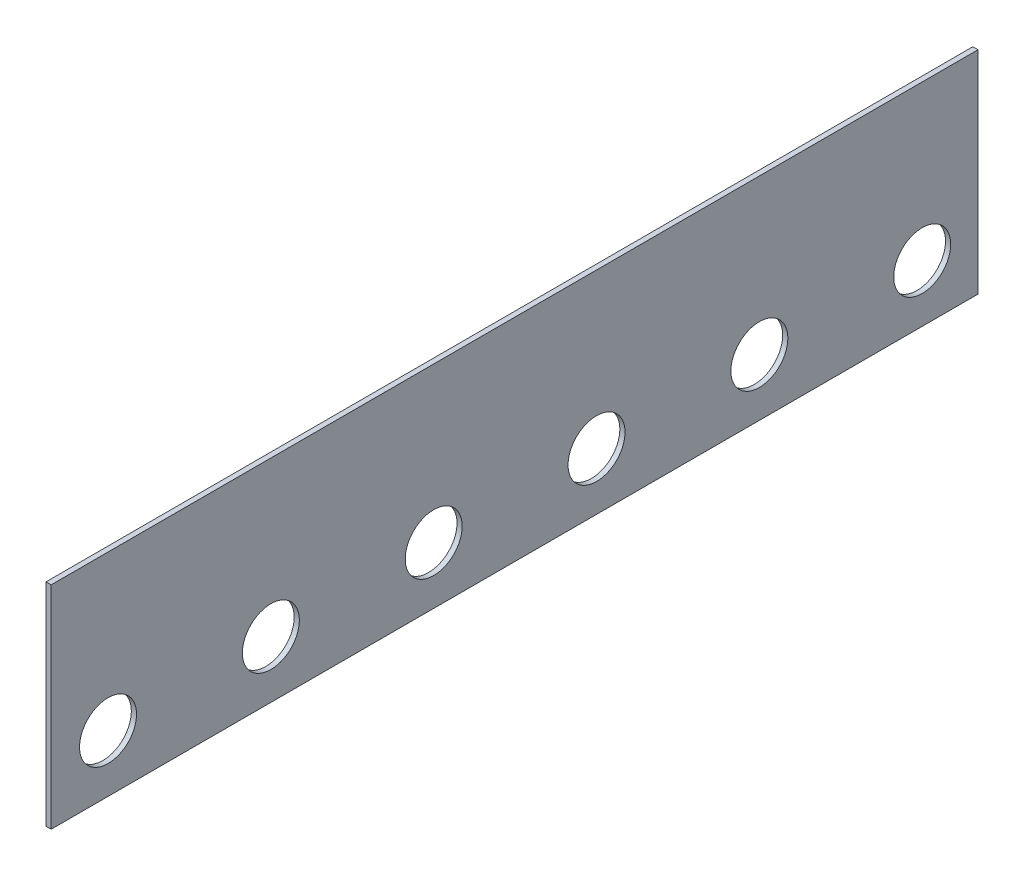
ISO-10303-21;
HEADER;
FILE_DESCRIPTION(('STEP AP214'),'2;1');
FILE_NAME('part.step','',(''),(''),'','','');
FILE_SCHEMA(('AUTOMOTIVE_DESIGN { 1 0 10303 214 1 1 1 1 }'));
ENDSEC;
DATA;
#1=APPLICATION_CONTEXT('core data for automotive mechanical design processes');
#2=APPLICATION_PROTOCOL_DEFINITION('international standard','automotive_design',2000,#1);
#3=PRODUCT_CONTEXT('',#1,'mechanical');
#4=PRODUCT('Part','Part','',(#3));
#5=PRODUCT_RELATED_PRODUCT_CATEGORY('part','',(#4));
#6=PRODUCT_DEFINITION_FORMATION('','',#4);
#7=PRODUCT_DEFINITION_CONTEXT('part definition',#1,'design');
#8=PRODUCT_DEFINITION('design','',#6,#7);
#9=PRODUCT_DEFINITION_SHAPE('','',#8);
#10=(LENGTH_UNIT() NAMED_UNIT(*) SI_UNIT(.MILLI.,.METRE.));
#11=(NAMED_UNIT(*) PLANE_ANGLE_UNIT() SI_UNIT($,.RADIAN.));
#12=(NAMED_UNIT(*) SI_UNIT($,.STERADIAN.) SOLID_ANGLE_UNIT());
#13=UNCERTAINTY_MEASURE_WITH_UNIT(LENGTH_MEASURE(1.E-05),#10,'distance_accuracy_value','');
#14=(GEOMETRIC_REPRESENTATION_CONTEXT(3) GLOBAL_UNCERTAINTY_ASSIGNED_CONTEXT((#13)) GLOBAL_UNIT_ASSIGNED_CONTEXT((#10,
#11,#12)) REPRESENTATION_CONTEXT('',''));
#15=CARTESIAN_POINT('',(0.,0.,0.));
#16=DIRECTION('',(0.,0.,1.));
#17=DIRECTION('',(1.,0.,0.));
#18=AXIS2_PLACEMENT_3D('',#15,#16,#17);
#19=CARTESIAN_POINT('',(3.175,0.,264.709663373096));
#20=DIRECTION('',(1.,0.,0.));
#21=DIRECTION('',(0.,0.,-1.));
#22=AXIS2_PLACEMENT_3D('',#19,#20,#21);
#23=PLANE('',#22);
#24=CARTESIAN_POINT('',(3.175,1.01307850997046E-13,-135.290336626904));
#25=DIRECTION('',(1.,0.,0.));
#26=DIRECTION('',(0.,0.,-1.));
#27=AXIS2_PLACEMENT_3D('',#24,#25,#26);
#28=CIRCLE('',#27,17.5);
#29=CARTESIAN_POINT('',(3.175,1.01307850997046E-13,-152.790336626904));
#30=VERTEX_POINT('',#29);
#31=EDGE_CURVE('E170',#30,#30,#28,.T.);
#32=ORIENTED_EDGE('',*,*,#31,.F.);
#33=EDGE_LOOP('',(#32));
#34=FACE_BOUND('',#33,.T.);
#35=CARTESIAN_POINT('',(3.175,0.,64.7096633730958));
#36=DIRECTION('',(1.,0.,0.));
#37=DIRECTION('',(0.,0.,-1.));
#38=AXIS2_PLACEMENT_3D('',#35,#36,#37);
#39=CIRCLE('',#38,17.5);
#40=CARTESIAN_POINT('',(3.175,0.,47.2096633730957));
#41=VERTEX_POINT('',#40);
#42=EDGE_CURVE('E158',#41,#41,#39,.T.);
#43=ORIENTED_EDGE('',*,*,#42,.F.);
#44=EDGE_LOOP('',(#43));
#45=FACE_BOUND('',#44,.T.);
#46=CARTESIAN_POINT('',(3.175,0.,264.709663373096));
#47=DIRECTION('',(1.,0.,0.));
#48=DIRECTION('',(0.,0.,-1.));
#49=AXIS2_PLACEMENT_3D('',#46,#47,#48);
#50=CIRCLE('',#49,17.5);
#51=CARTESIAN_POINT('',(3.175,0.,247.209663373096));
#52=VERTEX_POINT('',#51);
#53=EDGE_CURVE('E127',#52,#52,#50,.T.);
#54=ORIENTED_EDGE('',*,*,#53,.F.);
#55=EDGE_LOOP('',(#54));
#56=FACE_BOUND('',#55,.T.);
#57=DIRECTION('',(0.,1.,0.));
#58=VECTOR('',#57,1.);
#59=CARTESIAN_POINT('',(3.175,7.5,-269.561502976641));
#60=LINE('',#59,#58);
#61=CARTESIAN_POINT('',(3.175,-34.9990034721348,-269.561502976641));
#62=VERTEX_POINT('',#61);
#63=CARTESIAN_POINT('',(3.175,94.9999999999998,-269.561502976641));
#64=VERTEX_POINT('',#63);
#65=EDGE_CURVE('E51',#62,#64,#60,.T.);
#66=ORIENTED_EDGE('',*,*,#65,.T.);
#67=DIRECTION('',(0.,0.,1.));
#68=VECTOR('',#67,1.);
#69=CARTESIAN_POINT('',(3.175,94.9999999999997,299.6284595529));
#70=LINE('',#69,#68);
#71=CARTESIAN_POINT('',(3.175,94.9999999999997,299.6284595529));
#72=VERTEX_POINT('',#71);
#73=EDGE_CURVE('E89',#64,#72,#70,.T.);
#74=ORIENTED_EDGE('',*,*,#73,.T.);
#75=DIRECTION('',(0.,-1.,0.));
#76=VECTOR('',#75,1.);
#77=CARTESIAN_POINT('',(3.175,-1.13674568028599E-13,299.6284595529));
#78=LINE('',#77,#76);
#79=CARTESIAN_POINT('',(3.175,-35.,299.6284595529));
#80=VERTEX_POINT('',#79);
#81=EDGE_CURVE('E103',#72,#80,#78,.T.);
#82=ORIENTED_EDGE('',*,*,#81,.T.);
#83=DIRECTION('',(0.,0.,-1.));
#84=VECTOR('',#83,1.);
#85=CARTESIAN_POINT('',(3.175,-35.,265.081967213115));
#86=LINE('',#85,#84);
#87=CARTESIAN_POINT('',(3.175,-35.,265.081967213115));
#88=VERTEX_POINT('',#87);
#89=EDGE_CURVE('E97',#80,#88,#86,.T.);
#90=ORIENTED_EDGE('',*,*,#89,.T.);
#91=CARTESIAN_POINT('',(3.175,0.,264.709663373096));
#92=DIRECTION('',(-1.,0.,0.));
#93=DIRECTION('',(0.,0.,-1.));
#94=AXIS2_PLACEMENT_3D('',#91,#92,#93);
#95=CIRCLE('',#94,35.0019800889791);
#96=CARTESIAN_POINT('',(3.175,-34.9990034721349,265.166134737783));
#97=VERTEX_POINT('',#96);
#98=EDGE_CURVE('E101',#88,#97,#95,.T.);
#99=ORIENTED_EDGE('',*,*,#98,.T.);
#100=DIRECTION('',(0.,0.,-1.));
#101=VECTOR('',#100,1.);
#102=CARTESIAN_POINT('',(3.175,-34.9990034721348,265.166134737783));
#103=LINE('',#102,#101);
#104=EDGE_CURVE('E117',#97,#62,#103,.T.);
#105=ORIENTED_EDGE('',*,*,#104,.T.);
#106=EDGE_LOOP('',(#66,#74,#82,#90,#99,#105));
#107=FACE_BOUND('',#106,.T.);
#108=CARTESIAN_POINT('',(3.175,0.,164.709663373096));
#109=DIRECTION('',(1.,0.,0.));
#110=DIRECTION('',(0.,0.,-1.));
#111=AXIS2_PLACEMENT_3D('',#108,#109,#110);
#112=CIRCLE('',#111,17.5);
#113=CARTESIAN_POINT('',(3.175,0.,147.209663373096));
#114=VERTEX_POINT('',#113);
#115=EDGE_CURVE('E152',#114,#114,#112,.T.);
#116=ORIENTED_EDGE('',*,*,#115,.F.);
#117=EDGE_LOOP('',(#116));
#118=FACE_BOUND('',#117,.T.);
#119=CARTESIAN_POINT('',(3.175,0.,-35.2903366269043));
#120=DIRECTION('',(1.,0.,0.));
#121=DIRECTION('',(0.,0.,-1.));
#122=AXIS2_PLACEMENT_3D('',#119,#120,#121);
#123=CIRCLE('',#122,17.5);
#124=CARTESIAN_POINT('',(3.175,0.,-52.7903366269043));
#125=VERTEX_POINT('',#124);
#126=EDGE_CURVE('E164',#125,#125,#123,.T.);
#127=ORIENTED_EDGE('',*,*,#126,.F.);
#128=EDGE_LOOP('',(#127));
#129=FACE_BOUND('',#128,.T.);
#130=CARTESIAN_POINT('',(3.175,1.2490009027033E-13,-235.290336626904));
#131=DIRECTION('',(1.,0.,0.));
#132=DIRECTION('',(0.,0.,-1.));
#133=AXIS2_PLACEMENT_3D('',#130,#131,#132);
#134=CIRCLE('',#133,17.5000000000001);
#135=CARTESIAN_POINT('',(3.175,1.2490009027033E-13,-252.790336626904));
#136=VERTEX_POINT('',#135);
#137=EDGE_CURVE('E176',#136,#136,#134,.T.);
#138=ORIENTED_EDGE('',*,*,#137,.F.);
#139=EDGE_LOOP('',(#138));
#140=FACE_BOUND('',#139,.T.);
#141=ADVANCED_FACE('F34',(#34,#45,#56,#107,#118,#129,#140),#23,.T.);
#142=CARTESIAN_POINT('',(0.,0.,264.709663373096));
#143=DIRECTION('',(1.,0.,0.));
#144=DIRECTION('',(0.,0.,-1.));
#145=AXIS2_PLACEMENT_3D('',#142,#143,#144);
#146=PLANE('',#145);
#147=DIRECTION('',(0.,0.,1.));
#148=VECTOR('',#147,1.);
#149=CARTESIAN_POINT('',(0.,94.9999999999997,299.6284595529));
#150=LINE('',#149,#148);
#151=CARTESIAN_POINT('',(0.,94.9999999999998,-269.561502976641));
#152=VERTEX_POINT('',#151);
#153=CARTESIAN_POINT('',(0.,94.9999999999997,299.6284595529));
#154=VERTEX_POINT('',#153);
#155=EDGE_CURVE('E123',#152,#154,#150,.T.);
#156=ORIENTED_EDGE('',*,*,#155,.F.);
#157=DIRECTION('',(0.,1.,0.));
#158=VECTOR('',#157,1.);
#159=CARTESIAN_POINT('',(0.,7.5,-269.561502976641));
#160=LINE('',#159,#158);
#161=CARTESIAN_POINT('',(0.,-34.9990034721348,-269.561502976641));
#162=VERTEX_POINT('',#161);
#163=EDGE_CURVE('E132',#162,#152,#160,.T.);
#164=ORIENTED_EDGE('',*,*,#163,.F.);
#165=DIRECTION('',(0.,0.,-1.));
#166=VECTOR('',#165,1.);
#167=CARTESIAN_POINT('',(0.,-34.9990034721348,265.166134737783));
#168=LINE('',#167,#166);
#169=CARTESIAN_POINT('',(0.,-34.9990034721349,265.166134737783));
#170=VERTEX_POINT('',#169);
#171=EDGE_CURVE('E82',#170,#162,#168,.T.);
#172=ORIENTED_EDGE('',*,*,#171,.F.);
#173=CARTESIAN_POINT('',(0.,0.,264.709663373096));
#174=DIRECTION('',(-1.,0.,0.));
#175=DIRECTION('',(0.,0.,-1.));
#176=AXIS2_PLACEMENT_3D('',#173,#174,#175);
#177=CIRCLE('',#176,35.0019800889791);
#178=CARTESIAN_POINT('',(0.,-35.,265.081967213115));
#179=VERTEX_POINT('',#178);
#180=EDGE_CURVE('E75',#179,#170,#177,.T.);
#181=ORIENTED_EDGE('',*,*,#180,.F.);
#182=DIRECTION('',(0.,0.,-1.));
#183=VECTOR('',#182,1.);
#184=CARTESIAN_POINT('',(0.,-35.,265.081967213115));
#185=LINE('',#184,#183);
#186=CARTESIAN_POINT('',(0.,-35.,299.6284595529));
#187=VERTEX_POINT('',#186);
#188=EDGE_CURVE('E111',#187,#179,#185,.T.);
#189=ORIENTED_EDGE('',*,*,#188,.F.);
#190=DIRECTION('',(0.,-1.,0.));
#191=VECTOR('',#190,1.);
#192=CARTESIAN_POINT('',(0.,-1.13674568028599E-13,299.6284595529));
#193=LINE('',#192,#191);
#194=EDGE_CURVE('E126',#154,#187,#193,.T.);
#195=ORIENTED_EDGE('',*,*,#194,.F.);
#196=EDGE_LOOP('',(#156,#164,#172,#181,#189,#195));
#197=FACE_BOUND('',#196,.T.);
#198=CARTESIAN_POINT('',(0.,0.,264.709663373096));
#199=DIRECTION('',(1.,0.,0.));
#200=DIRECTION('',(0.,0.,-1.));
#201=AXIS2_PLACEMENT_3D('',#198,#199,#200);
#202=CIRCLE('',#201,17.5);
#203=CARTESIAN_POINT('',(0.,0.,247.209663373096));
#204=VERTEX_POINT('',#203);
#205=EDGE_CURVE('E149',#204,#204,#202,.T.);
#206=ORIENTED_EDGE('',*,*,#205,.T.);
#207=EDGE_LOOP('',(#206));
#208=FACE_BOUND('',#207,.T.);
#209=CARTESIAN_POINT('',(0.,0.,164.709663373096));
#210=DIRECTION('',(1.,0.,0.));
#211=DIRECTION('',(0.,0.,-1.));
#212=AXIS2_PLACEMENT_3D('',#209,#210,#211);
#213=CIRCLE('',#212,17.5);
#214=CARTESIAN_POINT('',(0.,0.,147.209663373096));
#215=VERTEX_POINT('',#214);
#216=EDGE_CURVE('E155',#215,#215,#213,.T.);
#217=ORIENTED_EDGE('',*,*,#216,.T.);
#218=EDGE_LOOP('',(#217));
#219=FACE_BOUND('',#218,.T.);
#220=CARTESIAN_POINT('',(0.,0.,64.7096633730958));
#221=DIRECTION('',(1.,0.,0.));
#222=DIRECTION('',(0.,0.,-1.));
#223=AXIS2_PLACEMENT_3D('',#220,#221,#222);
#224=CIRCLE('',#223,17.5);
#225=CARTESIAN_POINT('',(0.,0.,47.2096633730957));
#226=VERTEX_POINT('',#225);
#227=EDGE_CURVE('E161',#226,#226,#224,.T.);
#228=ORIENTED_EDGE('',*,*,#227,.T.);
#229=EDGE_LOOP('',(#228));
#230=FACE_BOUND('',#229,.T.);
#231=CARTESIAN_POINT('',(0.,0.,-35.2903366269043));
#232=DIRECTION('',(1.,0.,0.));
#233=DIRECTION('',(0.,0.,-1.));
#234=AXIS2_PLACEMENT_3D('',#231,#232,#233);
#235=CIRCLE('',#234,17.5);
#236=CARTESIAN_POINT('',(0.,0.,-52.7903366269043));
#237=VERTEX_POINT('',#236);
#238=EDGE_CURVE('E167',#237,#237,#235,.T.);
#239=ORIENTED_EDGE('',*,*,#238,.T.);
#240=EDGE_LOOP('',(#239));
#241=FACE_BOUND('',#240,.T.);
#242=CARTESIAN_POINT('',(0.,1.01307850997046E-13,-135.290336626904));
#243=DIRECTION('',(1.,0.,0.));
#244=DIRECTION('',(0.,0.,-1.));
#245=AXIS2_PLACEMENT_3D('',#242,#243,#244);
#246=CIRCLE('',#245,17.5);
#247=CARTESIAN_POINT('',(0.,1.01307850997046E-13,-152.790336626904));
#248=VERTEX_POINT('',#247);
#249=EDGE_CURVE('E173',#248,#248,#246,.T.);
#250=ORIENTED_EDGE('',*,*,#249,.T.);
#251=EDGE_LOOP('',(#250));
#252=FACE_BOUND('',#251,.T.);
#253=CARTESIAN_POINT('',(0.,1.2490009027033E-13,-235.290336626904));
#254=DIRECTION('',(1.,0.,0.));
#255=DIRECTION('',(0.,0.,-1.));
#256=AXIS2_PLACEMENT_3D('',#253,#254,#255);
#257=CIRCLE('',#256,17.5000000000001);
#258=CARTESIAN_POINT('',(0.,1.2490009027033E-13,-252.790336626904));
#259=VERTEX_POINT('',#258);
#260=EDGE_CURVE('E179',#259,#259,#257,.T.);
#261=ORIENTED_EDGE('',*,*,#260,.T.);
#262=EDGE_LOOP('',(#261));
#263=FACE_BOUND('',#262,.T.);
#264=ADVANCED_FACE('F142',(#197,#208,#219,#230,#241,#252,#263),#146,.F.);
#265=CARTESIAN_POINT('',(3.175,94.9999999999997,299.6284595529));
#266=DIRECTION('',(0.,-1.,0.));
#267=DIRECTION('',(0.,0.,-1.));
#268=AXIS2_PLACEMENT_3D('',#265,#266,#267);
#269=PLANE('',#268);
#270=ORIENTED_EDGE('',*,*,#155,.T.);
#271=DIRECTION('',(-1.,0.,0.));
#272=VECTOR('',#271,1.);
#273=CARTESIAN_POINT('',(3.175,94.9999999999997,299.6284595529));
#274=LINE('',#273,#272);
#275=EDGE_CURVE('E43',#72,#154,#274,.T.);
#276=ORIENTED_EDGE('',*,*,#275,.F.);
#277=ORIENTED_EDGE('',*,*,#73,.F.);
#278=DIRECTION('',(-1.,0.,0.));
#279=VECTOR('',#278,1.);
#280=CARTESIAN_POINT('',(3.175,94.9999999999998,-269.561502976641));
#281=LINE('',#280,#279);
#282=EDGE_CURVE('E11',#64,#152,#281,.T.);
#283=ORIENTED_EDGE('',*,*,#282,.T.);
#284=EDGE_LOOP('',(#270,#276,#277,#283));
#285=FACE_BOUND('',#284,.T.);
#286=ADVANCED_FACE('F36',(#285),#269,.F.);
#287=CARTESIAN_POINT('',(3.175,-1.13674568028599E-13,299.6284595529));
#288=DIRECTION('',(0.,0.,-1.));
#289=DIRECTION('',(-1.,0.,0.));
#290=AXIS2_PLACEMENT_3D('',#287,#288,#289);
#291=PLANE('',#290);
#292=ORIENTED_EDGE('',*,*,#194,.T.);
#293=DIRECTION('',(-1.,0.,0.));
#294=VECTOR('',#293,1.);
#295=CARTESIAN_POINT('',(3.175,-35.,299.6284595529));
#296=LINE('',#295,#294);
#297=EDGE_CURVE('E112',#80,#187,#296,.T.);
#298=ORIENTED_EDGE('',*,*,#297,.F.);
#299=ORIENTED_EDGE('',*,*,#81,.F.);
#300=ORIENTED_EDGE('',*,*,#275,.T.);
#301=EDGE_LOOP('',(#292,#298,#299,#300));
#302=FACE_BOUND('',#301,.T.);
#303=ADVANCED_FACE('F138',(#302),#291,.F.);
#304=CARTESIAN_POINT('',(3.175,-35.,265.081967213115));
#305=DIRECTION('',(0.,1.,0.));
#306=DIRECTION('',(0.,0.,1.));
#307=AXIS2_PLACEMENT_3D('',#304,#305,#306);
#308=PLANE('',#307);
#309=ORIENTED_EDGE('',*,*,#188,.T.);
#310=DIRECTION('',(-1.,0.,0.));
#311=VECTOR('',#310,1.);
#312=CARTESIAN_POINT('',(3.175,-35.,265.081967213115));
#313=LINE('',#312,#311);
#314=EDGE_CURVE('E108',#88,#179,#313,.T.);
#315=ORIENTED_EDGE('',*,*,#314,.F.);
#316=ORIENTED_EDGE('',*,*,#89,.F.);
#317=ORIENTED_EDGE('',*,*,#297,.T.);
#318=EDGE_LOOP('',(#309,#315,#316,#317));
#319=FACE_BOUND('',#318,.T.);
#320=ADVANCED_FACE('F109',(#319),#308,.F.);
#321=CARTESIAN_POINT('',(3.175,0.,264.709663373096));
#322=DIRECTION('',(-1.,0.,0.));
#323=DIRECTION('',(0.,0.,1.));
#324=AXIS2_PLACEMENT_3D('',#321,#322,#323);
#325=CYLINDRICAL_SURFACE('',#324,35.0019800889791);
#326=ORIENTED_EDGE('',*,*,#180,.T.);
#327=DIRECTION('',(-1.,0.,0.));
#328=VECTOR('',#327,1.);
#329=CARTESIAN_POINT('',(3.175,-34.9990034721349,265.166134737783));
#330=LINE('',#329,#328);
#331=EDGE_CURVE('E113',#97,#170,#330,.T.);
#332=ORIENTED_EDGE('',*,*,#331,.F.);
#333=ORIENTED_EDGE('',*,*,#98,.F.);
#334=ORIENTED_EDGE('',*,*,#314,.T.);
#335=EDGE_LOOP('',(#326,#332,#333,#334));
#336=FACE_BOUND('',#335,.T.);
#337=ADVANCED_FACE('F115',(#336),#325,.F.);
#338=CARTESIAN_POINT('',(3.175,-34.9990034721348,265.166134737783));
#339=DIRECTION('',(0.,1.,0.));
#340=DIRECTION('',(0.,0.,1.));
#341=AXIS2_PLACEMENT_3D('',#338,#339,#340);
#342=PLANE('',#341);
#343=ORIENTED_EDGE('',*,*,#171,.T.);
#344=DIRECTION('',(-1.,0.,0.));
#345=VECTOR('',#344,1.);
#346=CARTESIAN_POINT('',(3.175,-34.9990034721348,-269.561502976641));
#347=LINE('',#346,#345);
#348=EDGE_CURVE('E119',#62,#162,#347,.T.);
#349=ORIENTED_EDGE('',*,*,#348,.F.);
#350=ORIENTED_EDGE('',*,*,#104,.F.);
#351=ORIENTED_EDGE('',*,*,#331,.T.);
#352=EDGE_LOOP('',(#343,#349,#350,#351));
#353=FACE_BOUND('',#352,.T.);
#354=ADVANCED_FACE('F145',(#353),#342,.F.);
#355=CARTESIAN_POINT('',(3.175,7.5,-269.561502976641));
#356=DIRECTION('',(0.,0.,1.));
#357=DIRECTION('',(1.,0.,0.));
#358=AXIS2_PLACEMENT_3D('',#355,#356,#357);
#359=PLANE('',#358);
#360=ORIENTED_EDGE('',*,*,#163,.T.);
#361=ORIENTED_EDGE('',*,*,#282,.F.);
#362=ORIENTED_EDGE('',*,*,#65,.F.);
#363=ORIENTED_EDGE('',*,*,#348,.T.);
#364=EDGE_LOOP('',(#360,#361,#362,#363));
#365=FACE_BOUND('',#364,.T.);
#366=ADVANCED_FACE('F144',(#365),#359,.F.);
#367=CARTESIAN_POINT('',(3.175,0.,264.709663373096));
#368=DIRECTION('',(-1.,0.,0.));
#369=DIRECTION('',(0.,0.,1.));
#370=AXIS2_PLACEMENT_3D('',#367,#368,#369);
#371=CYLINDRICAL_SURFACE('',#370,17.5);
#372=ORIENTED_EDGE('',*,*,#53,.T.);
#373=EDGE_LOOP('',(#372));
#374=FACE_BOUND('',#373,.T.);
#375=ORIENTED_EDGE('',*,*,#205,.F.);
#376=EDGE_LOOP('',(#375));
#377=FACE_BOUND('',#376,.T.);
#378=ADVANCED_FACE('F198',(#374,#377),#371,.F.);
#379=CARTESIAN_POINT('',(3.175,0.,164.709663373096));
#380=DIRECTION('',(-1.,0.,0.));
#381=DIRECTION('',(0.,0.,1.));
#382=AXIS2_PLACEMENT_3D('',#379,#380,#381);
#383=CYLINDRICAL_SURFACE('',#382,17.5);
#384=ORIENTED_EDGE('',*,*,#115,.T.);
#385=EDGE_LOOP('',(#384));
#386=FACE_BOUND('',#385,.T.);
#387=ORIENTED_EDGE('',*,*,#216,.F.);
#388=EDGE_LOOP('',(#387));
#389=FACE_BOUND('',#388,.T.);
#390=ADVANCED_FACE('F264',(#386,#389),#383,.F.);
#391=CARTESIAN_POINT('',(3.175,0.,64.7096633730958));
#392=DIRECTION('',(-1.,0.,0.));
#393=DIRECTION('',(0.,0.,1.));
#394=AXIS2_PLACEMENT_3D('',#391,#392,#393);
#395=CYLINDRICAL_SURFACE('',#394,17.5);
#396=ORIENTED_EDGE('',*,*,#42,.T.);
#397=EDGE_LOOP('',(#396));
#398=FACE_BOUND('',#397,.T.);
#399=ORIENTED_EDGE('',*,*,#227,.F.);
#400=EDGE_LOOP('',(#399));
#401=FACE_BOUND('',#400,.T.);
#402=ADVANCED_FACE('F272',(#398,#401),#395,.F.);
#403=CARTESIAN_POINT('',(3.175,0.,-35.2903366269043));
#404=DIRECTION('',(-1.,0.,0.));
#405=DIRECTION('',(0.,0.,1.));
#406=AXIS2_PLACEMENT_3D('',#403,#404,#405);
#407=CYLINDRICAL_SURFACE('',#406,17.5);
#408=ORIENTED_EDGE('',*,*,#126,.T.);
#409=EDGE_LOOP('',(#408));
#410=FACE_BOUND('',#409,.T.);
#411=ORIENTED_EDGE('',*,*,#238,.F.);
#412=EDGE_LOOP('',(#411));
#413=FACE_BOUND('',#412,.T.);
#414=ADVANCED_FACE('F280',(#410,#413),#407,.F.);
#415=CARTESIAN_POINT('',(3.175,1.01307850997046E-13,-135.290336626904));
#416=DIRECTION('',(-1.,0.,0.));
#417=DIRECTION('',(0.,0.,1.));
#418=AXIS2_PLACEMENT_3D('',#415,#416,#417);
#419=CYLINDRICAL_SURFACE('',#418,17.5);
#420=ORIENTED_EDGE('',*,*,#31,.T.);
#421=EDGE_LOOP('',(#420));
#422=FACE_BOUND('',#421,.T.);
#423=ORIENTED_EDGE('',*,*,#249,.F.);
#424=EDGE_LOOP('',(#423));
#425=FACE_BOUND('',#424,.T.);
#426=ADVANCED_FACE('F289',(#422,#425),#419,.F.);
#427=CARTESIAN_POINT('',(3.175,1.2490009027033E-13,-235.290336626904));
#428=DIRECTION('',(-1.,0.,0.));
#429=DIRECTION('',(0.,0.,1.));
#430=AXIS2_PLACEMENT_3D('',#427,#428,#429);
#431=CYLINDRICAL_SURFACE('',#430,17.5000000000001);
#432=ORIENTED_EDGE('',*,*,#137,.T.);
#433=EDGE_LOOP('',(#432));
#434=FACE_BOUND('',#433,.T.);
#435=ORIENTED_EDGE('',*,*,#260,.F.);
#436=EDGE_LOOP('',(#435));
#437=FACE_BOUND('',#436,.T.);
#438=ADVANCED_FACE('F185',(#434,#437),#431,.F.);
#439=CLOSED_SHELL('',(#141,#264,#286,#303,#320,#337,#354,#366,#378,#390,#402,#414,#426,#438));
#440=MANIFOLD_SOLID_BREP('B2',#439);
#441=ADVANCED_BREP_SHAPE_REPRESENTATION('',(#18,#440),#14);
#442=SHAPE_DEFINITION_REPRESENTATION(#9,#441);
ENDSEC;
END-ISO-10303-21;
